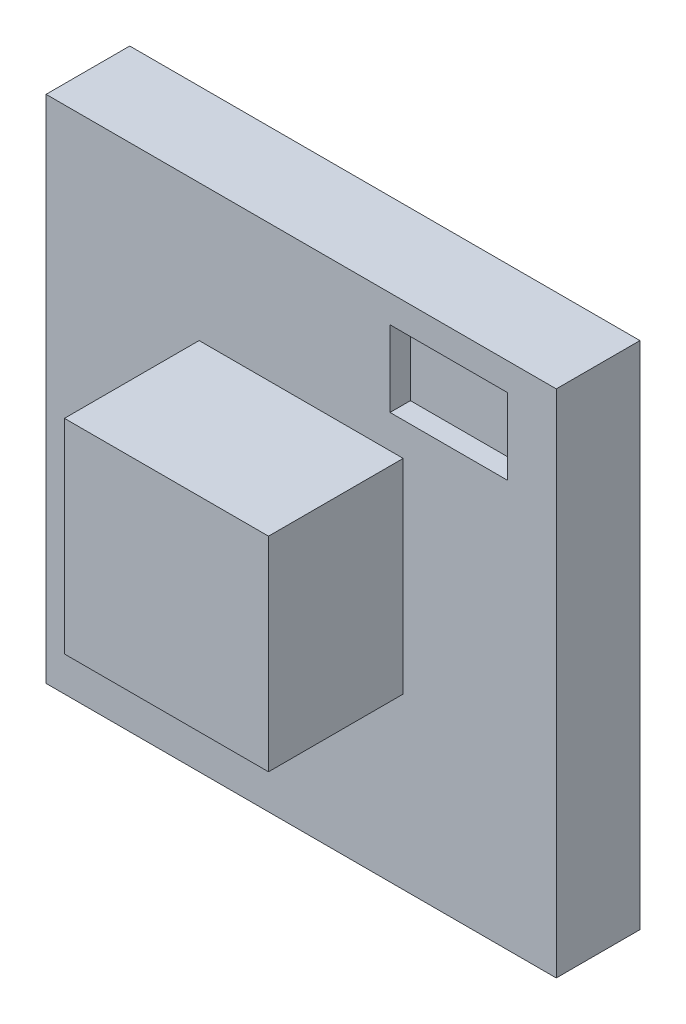
ISO-10303-21;
HEADER;
FILE_DESCRIPTION(('STEP AP214'),'2;1');
FILE_NAME('part.step','',(''),(''),'','','');
FILE_SCHEMA(('AUTOMOTIVE_DESIGN { 1 0 10303 214 1 1 1 1 }'));
ENDSEC;
DATA;
#1=APPLICATION_CONTEXT('core data for automotive mechanical design processes');
#2=APPLICATION_PROTOCOL_DEFINITION('international standard','automotive_design',2000,#1);
#3=PRODUCT_CONTEXT('',#1,'mechanical');
#4=PRODUCT('Part','Part','',(#3));
#5=PRODUCT_RELATED_PRODUCT_CATEGORY('part','',(#4));
#6=PRODUCT_DEFINITION_FORMATION('','',#4);
#7=PRODUCT_DEFINITION_CONTEXT('part definition',#1,'design');
#8=PRODUCT_DEFINITION('design','',#6,#7);
#9=PRODUCT_DEFINITION_SHAPE('','',#8);
#10=(LENGTH_UNIT() NAMED_UNIT(*) SI_UNIT(.MILLI.,.METRE.));
#11=(NAMED_UNIT(*) PLANE_ANGLE_UNIT() SI_UNIT($,.RADIAN.));
#12=(NAMED_UNIT(*) SI_UNIT($,.STERADIAN.) SOLID_ANGLE_UNIT());
#13=UNCERTAINTY_MEASURE_WITH_UNIT(LENGTH_MEASURE(1.E-05),#10,'distance_accuracy_value','');
#14=(GEOMETRIC_REPRESENTATION_CONTEXT(3) GLOBAL_UNCERTAINTY_ASSIGNED_CONTEXT((#13)) GLOBAL_UNIT_ASSIGNED_CONTEXT((#10,
#11,#12)) REPRESENTATION_CONTEXT('',''));
#15=CARTESIAN_POINT('',(0.,0.,0.));
#16=DIRECTION('',(0.,0.,1.));
#17=DIRECTION('',(1.,0.,0.));
#18=AXIS2_PLACEMENT_3D('',#15,#16,#17);
#19=CARTESIAN_POINT('',(1.17550367050315,22.1247444678527,4.1));
#20=DIRECTION('',(-1.,0.,0.));
#21=DIRECTION('',(0.,-1.,0.));
#22=AXIS2_PLACEMENT_3D('',#19,#20,#21);
#23=PLANE('',#22);
#24=DIRECTION('',(0.,1.,0.));
#25=VECTOR('',#24,1.);
#26=CARTESIAN_POINT('',(1.17550367050315,22.1247444678527,0.));
#27=LINE('',#26,#25);
#28=CARTESIAN_POINT('',(1.17550367050316,-2.87525553214727,0.));
#29=VERTEX_POINT('',#28);
#30=CARTESIAN_POINT('',(1.17550367050315,22.1247444678527,0.));
#31=VERTEX_POINT('',#30);
#32=EDGE_CURVE('E197',#29,#31,#27,.T.);
#33=ORIENTED_EDGE('',*,*,#32,.T.);
#34=DIRECTION('',(0.,0.,-1.));
#35=VECTOR('',#34,1.);
#36=CARTESIAN_POINT('',(1.17550367050315,22.1247444678527,4.1));
#37=LINE('',#36,#35);
#38=CARTESIAN_POINT('',(1.17550367050315,22.1247444678527,4.1));
#39=VERTEX_POINT('',#38);
#40=EDGE_CURVE('E11',#39,#31,#37,.T.);
#41=ORIENTED_EDGE('',*,*,#40,.F.);
#42=DIRECTION('',(0.,1.,0.));
#43=VECTOR('',#42,1.);
#44=CARTESIAN_POINT('',(1.17550367050315,22.1247444678527,4.1));
#45=LINE('',#44,#43);
#46=CARTESIAN_POINT('',(1.17550367050316,-2.87525553214727,4.1));
#47=VERTEX_POINT('',#46);
#48=EDGE_CURVE('E198',#47,#39,#45,.T.);
#49=ORIENTED_EDGE('',*,*,#48,.F.);
#50=DIRECTION('',(0.,0.,-1.));
#51=VECTOR('',#50,1.);
#52=CARTESIAN_POINT('',(1.17550367050316,-2.87525553214727,4.1));
#53=LINE('',#52,#51);
#54=EDGE_CURVE('E208',#47,#29,#53,.T.);
#55=ORIENTED_EDGE('',*,*,#54,.T.);
#56=EDGE_LOOP('',(#33,#41,#49,#55));
#57=FACE_BOUND('',#56,.T.);
#58=ADVANCED_FACE('F41',(#57),#23,.F.);
#59=CARTESIAN_POINT('',(-23.8244963294968,22.1247444678527,4.1));
#60=DIRECTION('',(0.,-1.,0.));
#61=DIRECTION('',(0.,0.,-1.));
#62=AXIS2_PLACEMENT_3D('',#59,#60,#61);
#63=PLANE('',#62);
#64=DIRECTION('',(-1.,0.,0.));
#65=VECTOR('',#64,1.);
#66=CARTESIAN_POINT('',(-23.8244963294968,22.1247444678527,0.));
#67=LINE('',#66,#65);
#68=CARTESIAN_POINT('',(-23.8244963294968,22.1247444678527,0.));
#69=VERTEX_POINT('',#68);
#70=EDGE_CURVE('E211',#31,#69,#67,.T.);
#71=ORIENTED_EDGE('',*,*,#70,.T.);
#72=DIRECTION('',(0.,0.,-1.));
#73=VECTOR('',#72,1.);
#74=CARTESIAN_POINT('',(-23.8244963294968,22.1247444678527,4.1));
#75=LINE('',#74,#73);
#76=CARTESIAN_POINT('',(-23.8244963294968,22.1247444678527,4.1));
#77=VERTEX_POINT('',#76);
#78=EDGE_CURVE('E48',#77,#69,#75,.T.);
#79=ORIENTED_EDGE('',*,*,#78,.F.);
#80=DIRECTION('',(-1.,0.,0.));
#81=VECTOR('',#80,1.);
#82=CARTESIAN_POINT('',(-23.8244963294968,22.1247444678527,4.1));
#83=LINE('',#82,#81);
#84=EDGE_CURVE('E201',#39,#77,#83,.T.);
#85=ORIENTED_EDGE('',*,*,#84,.F.);
#86=ORIENTED_EDGE('',*,*,#40,.T.);
#87=EDGE_LOOP('',(#71,#79,#85,#86));
#88=FACE_BOUND('',#87,.T.);
#89=ADVANCED_FACE('F241',(#88),#63,.F.);
#90=CARTESIAN_POINT('',(-23.8244963294968,22.1247444678527,4.1));
#91=DIRECTION('',(1.,0.,0.));
#92=DIRECTION('',(0.,1.,0.));
#93=AXIS2_PLACEMENT_3D('',#90,#91,#92);
#94=PLANE('',#93);
#95=DIRECTION('',(0.,-1.,0.));
#96=VECTOR('',#95,1.);
#97=CARTESIAN_POINT('',(-23.8244963294968,22.1247444678527,0.));
#98=LINE('',#97,#96);
#99=CARTESIAN_POINT('',(-23.8244963294968,-2.87525553214727,0.));
#100=VERTEX_POINT('',#99);
#101=EDGE_CURVE('E213',#69,#100,#98,.T.);
#102=ORIENTED_EDGE('',*,*,#101,.T.);
#103=DIRECTION('',(0.,0.,-1.));
#104=VECTOR('',#103,1.);
#105=CARTESIAN_POINT('',(-23.8244963294968,-2.87525553214727,4.1));
#106=LINE('',#105,#104);
#107=CARTESIAN_POINT('',(-23.8244963294968,-2.87525553214727,4.1));
#108=VERTEX_POINT('',#107);
#109=EDGE_CURVE('E218',#108,#100,#106,.T.);
#110=ORIENTED_EDGE('',*,*,#109,.F.);
#111=DIRECTION('',(0.,-1.,0.));
#112=VECTOR('',#111,1.);
#113=CARTESIAN_POINT('',(-23.8244963294968,22.1247444678527,4.1));
#114=LINE('',#113,#112);
#115=EDGE_CURVE('E204',#77,#108,#114,.T.);
#116=ORIENTED_EDGE('',*,*,#115,.F.);
#117=ORIENTED_EDGE('',*,*,#78,.T.);
#118=EDGE_LOOP('',(#102,#110,#116,#117));
#119=FACE_BOUND('',#118,.T.);
#120=ADVANCED_FACE('F225',(#119),#94,.F.);
#121=CARTESIAN_POINT('',(-23.8244963294968,-2.87525553214727,4.1));
#122=DIRECTION('',(0.,1.,0.));
#123=DIRECTION('',(0.,0.,1.));
#124=AXIS2_PLACEMENT_3D('',#121,#122,#123);
#125=PLANE('',#124);
#126=DIRECTION('',(1.,0.,0.));
#127=VECTOR('',#126,1.);
#128=CARTESIAN_POINT('',(-23.8244963294968,-2.87525553214727,0.));
#129=LINE('',#128,#127);
#130=EDGE_CURVE('E202',#100,#29,#129,.T.);
#131=ORIENTED_EDGE('',*,*,#130,.T.);
#132=ORIENTED_EDGE('',*,*,#54,.F.);
#133=DIRECTION('',(1.,0.,0.));
#134=VECTOR('',#133,1.);
#135=CARTESIAN_POINT('',(-23.8244963294968,-2.87525553214727,4.1));
#136=LINE('',#135,#134);
#137=EDGE_CURVE('E206',#108,#47,#136,.T.);
#138=ORIENTED_EDGE('',*,*,#137,.F.);
#139=ORIENTED_EDGE('',*,*,#109,.T.);
#140=EDGE_LOOP('',(#131,#132,#138,#139));
#141=FACE_BOUND('',#140,.T.);
#142=ADVANCED_FACE('F234',(#141),#125,.F.);
#143=CARTESIAN_POINT('',(0.,0.,4.1));
#144=DIRECTION('',(0.,0.,1.));
#145=DIRECTION('',(1.,0.,0.));
#146=AXIS2_PLACEMENT_3D('',#143,#144,#145);
#147=PLANE('',#146);
#148=DIRECTION('',(0.,1.,0.));
#149=VECTOR('',#148,1.);
#150=CARTESIAN_POINT('',(-1.21218412122066,20.7728664335739,4.1));
#151=LINE('',#150,#149);
#152=CARTESIAN_POINT('',(-1.21218412122066,17.0509737458055,4.1));
#153=VERTEX_POINT('',#152);
#154=CARTESIAN_POINT('',(-1.21218412122066,20.7728664335739,4.1));
#155=VERTEX_POINT('',#154);
#156=EDGE_CURVE('E55',#153,#155,#151,.T.);
#157=ORIENTED_EDGE('',*,*,#156,.F.);
#158=DIRECTION('',(1.,0.,0.));
#159=VECTOR('',#158,1.);
#160=CARTESIAN_POINT('',(-6.97058412871127,17.0509737458055,4.1));
#161=LINE('',#160,#159);
#162=CARTESIAN_POINT('',(-6.97058412871127,17.0509737458055,4.1));
#163=VERTEX_POINT('',#162);
#164=EDGE_CURVE('E149',#163,#153,#161,.T.);
#165=ORIENTED_EDGE('',*,*,#164,.F.);
#166=DIRECTION('',(0.,-1.,0.));
#167=VECTOR('',#166,1.);
#168=CARTESIAN_POINT('',(-6.97058412871127,20.7728664335739,4.1));
#169=LINE('',#168,#167);
#170=CARTESIAN_POINT('',(-6.97058412871127,20.7728664335739,4.1));
#171=VERTEX_POINT('',#170);
#172=EDGE_CURVE('E152',#171,#163,#169,.T.);
#173=ORIENTED_EDGE('',*,*,#172,.F.);
#174=DIRECTION('',(-1.,0.,0.));
#175=VECTOR('',#174,1.);
#176=CARTESIAN_POINT('',(-6.97058412871127,20.7728664335739,4.1));
#177=LINE('',#176,#175);
#178=EDGE_CURVE('E158',#155,#171,#177,.T.);
#179=ORIENTED_EDGE('',*,*,#178,.F.);
#180=EDGE_LOOP('',(#157,#165,#173,#179));
#181=FACE_BOUND('',#180,.T.);
#182=DIRECTION('',(0.,1.,0.));
#183=VECTOR('',#182,1.);
#184=CARTESIAN_POINT('',(-6.32449632949684,15.4247444678527,4.1));
#185=LINE('',#184,#183);
#186=CARTESIAN_POINT('',(-6.32449632949684,5.42474446785273,4.1));
#187=VERTEX_POINT('',#186);
#188=CARTESIAN_POINT('',(-6.32449632949684,15.4247444678527,4.1));
#189=VERTEX_POINT('',#188);
#190=EDGE_CURVE('E63',#187,#189,#185,.T.);
#191=ORIENTED_EDGE('',*,*,#190,.F.);
#192=DIRECTION('',(1.,0.,0.));
#193=VECTOR('',#192,1.);
#194=CARTESIAN_POINT('',(-16.3244963294968,5.42474446785273,4.1));
#195=LINE('',#194,#193);
#196=CARTESIAN_POINT('',(-16.3244963294968,5.42474446785273,4.1));
#197=VERTEX_POINT('',#196);
#198=EDGE_CURVE('E171',#197,#187,#195,.T.);
#199=ORIENTED_EDGE('',*,*,#198,.F.);
#200=DIRECTION('',(0.,-1.,0.));
#201=VECTOR('',#200,1.);
#202=CARTESIAN_POINT('',(-16.3244963294968,15.4247444678527,4.1));
#203=LINE('',#202,#201);
#204=CARTESIAN_POINT('',(-16.3244963294968,15.4247444678527,4.1));
#205=VERTEX_POINT('',#204);
#206=EDGE_CURVE('E182',#205,#197,#203,.T.);
#207=ORIENTED_EDGE('',*,*,#206,.F.);
#208=DIRECTION('',(-1.,0.,0.));
#209=VECTOR('',#208,1.);
#210=CARTESIAN_POINT('',(-16.3244963294968,15.4247444678527,4.1));
#211=LINE('',#210,#209);
#212=EDGE_CURVE('E179',#189,#205,#211,.T.);
#213=ORIENTED_EDGE('',*,*,#212,.F.);
#214=EDGE_LOOP('',(#191,#199,#207,#213));
#215=FACE_BOUND('',#214,.T.);
#216=ORIENTED_EDGE('',*,*,#48,.T.);
#217=ORIENTED_EDGE('',*,*,#84,.T.);
#218=ORIENTED_EDGE('',*,*,#115,.T.);
#219=ORIENTED_EDGE('',*,*,#137,.T.);
#220=EDGE_LOOP('',(#216,#217,#218,#219));
#221=FACE_BOUND('',#220,.T.);
#222=ADVANCED_FACE('F240',(#181,#215,#221),#147,.T.);
#223=CARTESIAN_POINT('',(0.,0.,0.));
#224=DIRECTION('',(0.,0.,1.));
#225=DIRECTION('',(1.,0.,0.));
#226=AXIS2_PLACEMENT_3D('',#223,#224,#225);
#227=PLANE('',#226);
#228=ORIENTED_EDGE('',*,*,#32,.F.);
#229=ORIENTED_EDGE('',*,*,#130,.F.);
#230=ORIENTED_EDGE('',*,*,#101,.F.);
#231=ORIENTED_EDGE('',*,*,#70,.F.);
#232=EDGE_LOOP('',(#228,#229,#230,#231));
#233=FACE_BOUND('',#232,.T.);
#234=ADVANCED_FACE('F231',(#233),#227,.F.);
#235=CARTESIAN_POINT('',(-6.32449632949684,15.4247444678527,10.7));
#236=DIRECTION('',(-1.,0.,0.));
#237=DIRECTION('',(0.,-1.,0.));
#238=AXIS2_PLACEMENT_3D('',#235,#236,#237);
#239=PLANE('',#238);
#240=ORIENTED_EDGE('',*,*,#190,.T.);
#241=DIRECTION('',(0.,0.,-1.));
#242=VECTOR('',#241,1.);
#243=CARTESIAN_POINT('',(-6.32449632949684,15.4247444678527,10.7));
#244=LINE('',#243,#242);
#245=CARTESIAN_POINT('',(-6.32449632949684,15.4247444678527,10.7));
#246=VERTEX_POINT('',#245);
#247=EDGE_CURVE('E194',#246,#189,#244,.T.);
#248=ORIENTED_EDGE('',*,*,#247,.F.);
#249=DIRECTION('',(0.,1.,0.));
#250=VECTOR('',#249,1.);
#251=CARTESIAN_POINT('',(-6.32449632949684,15.4247444678527,10.7));
#252=LINE('',#251,#250);
#253=CARTESIAN_POINT('',(-6.32449632949684,5.42474446785273,10.7));
#254=VERTEX_POINT('',#253);
#255=EDGE_CURVE('E167',#254,#246,#252,.T.);
#256=ORIENTED_EDGE('',*,*,#255,.F.);
#257=DIRECTION('',(0.,0.,-1.));
#258=VECTOR('',#257,1.);
#259=CARTESIAN_POINT('',(-6.32449632949684,5.42474446785273,10.7));
#260=LINE('',#259,#258);
#261=EDGE_CURVE('E177',#254,#187,#260,.T.);
#262=ORIENTED_EDGE('',*,*,#261,.T.);
#263=EDGE_LOOP('',(#240,#248,#256,#262));
#264=FACE_BOUND('',#263,.T.);
#265=ADVANCED_FACE('F253',(#264),#239,.F.);
#266=CARTESIAN_POINT('',(-16.3244963294968,15.4247444678527,10.7));
#267=DIRECTION('',(0.,-1.,0.));
#268=DIRECTION('',(0.,0.,-1.));
#269=AXIS2_PLACEMENT_3D('',#266,#267,#268);
#270=PLANE('',#269);
#271=ORIENTED_EDGE('',*,*,#212,.T.);
#272=DIRECTION('',(0.,0.,-1.));
#273=VECTOR('',#272,1.);
#274=CARTESIAN_POINT('',(-16.3244963294968,15.4247444678527,10.7));
#275=LINE('',#274,#273);
#276=CARTESIAN_POINT('',(-16.3244963294968,15.4247444678527,10.7));
#277=VERTEX_POINT('',#276);
#278=EDGE_CURVE('E191',#277,#205,#275,.T.);
#279=ORIENTED_EDGE('',*,*,#278,.F.);
#280=DIRECTION('',(-1.,0.,0.));
#281=VECTOR('',#280,1.);
#282=CARTESIAN_POINT('',(-16.3244963294968,15.4247444678527,10.7));
#283=LINE('',#282,#281);
#284=EDGE_CURVE('E170',#246,#277,#283,.T.);
#285=ORIENTED_EDGE('',*,*,#284,.F.);
#286=ORIENTED_EDGE('',*,*,#247,.T.);
#287=EDGE_LOOP('',(#271,#279,#285,#286));
#288=FACE_BOUND('',#287,.T.);
#289=ADVANCED_FACE('F259',(#288),#270,.F.);
#290=CARTESIAN_POINT('',(-16.3244963294968,15.4247444678527,10.7));
#291=DIRECTION('',(1.,0.,0.));
#292=DIRECTION('',(0.,1.,0.));
#293=AXIS2_PLACEMENT_3D('',#290,#291,#292);
#294=PLANE('',#293);
#295=ORIENTED_EDGE('',*,*,#206,.T.);
#296=DIRECTION('',(0.,0.,-1.));
#297=VECTOR('',#296,1.);
#298=CARTESIAN_POINT('',(-16.3244963294968,5.42474446785273,10.7));
#299=LINE('',#298,#297);
#300=CARTESIAN_POINT('',(-16.3244963294968,5.42474446785273,10.7));
#301=VERTEX_POINT('',#300);
#302=EDGE_CURVE('E188',#301,#197,#299,.T.);
#303=ORIENTED_EDGE('',*,*,#302,.F.);
#304=DIRECTION('',(0.,-1.,0.));
#305=VECTOR('',#304,1.);
#306=CARTESIAN_POINT('',(-16.3244963294968,15.4247444678527,10.7));
#307=LINE('',#306,#305);
#308=EDGE_CURVE('E173',#277,#301,#307,.T.);
#309=ORIENTED_EDGE('',*,*,#308,.F.);
#310=ORIENTED_EDGE('',*,*,#278,.T.);
#311=EDGE_LOOP('',(#295,#303,#309,#310));
#312=FACE_BOUND('',#311,.T.);
#313=ADVANCED_FACE('F263',(#312),#294,.F.);
#314=CARTESIAN_POINT('',(-16.3244963294968,5.42474446785273,10.7));
#315=DIRECTION('',(0.,1.,0.));
#316=DIRECTION('',(0.,0.,1.));
#317=AXIS2_PLACEMENT_3D('',#314,#315,#316);
#318=PLANE('',#317);
#319=ORIENTED_EDGE('',*,*,#198,.T.);
#320=ORIENTED_EDGE('',*,*,#261,.F.);
#321=DIRECTION('',(1.,0.,0.));
#322=VECTOR('',#321,1.);
#323=CARTESIAN_POINT('',(-16.3244963294968,5.42474446785273,10.7));
#324=LINE('',#323,#322);
#325=EDGE_CURVE('E175',#301,#254,#324,.T.);
#326=ORIENTED_EDGE('',*,*,#325,.F.);
#327=ORIENTED_EDGE('',*,*,#302,.T.);
#328=EDGE_LOOP('',(#319,#320,#326,#327));
#329=FACE_BOUND('',#328,.T.);
#330=ADVANCED_FACE('F267',(#329),#318,.F.);
#331=CARTESIAN_POINT('',(0.,0.,10.7));
#332=DIRECTION('',(0.,0.,1.));
#333=DIRECTION('',(1.,0.,0.));
#334=AXIS2_PLACEMENT_3D('',#331,#332,#333);
#335=PLANE('',#334);
#336=ORIENTED_EDGE('',*,*,#255,.T.);
#337=ORIENTED_EDGE('',*,*,#284,.T.);
#338=ORIENTED_EDGE('',*,*,#308,.T.);
#339=ORIENTED_EDGE('',*,*,#325,.T.);
#340=EDGE_LOOP('',(#336,#337,#338,#339));
#341=FACE_BOUND('',#340,.T.);
#342=ADVANCED_FACE('F271',(#341),#335,.T.);
#343=CARTESIAN_POINT('',(-1.21218412122066,20.7728664335739,3.1));
#344=DIRECTION('',(1.,0.,0.));
#345=DIRECTION('',(0.,0.,-1.));
#346=AXIS2_PLACEMENT_3D('',#343,#344,#345);
#347=PLANE('',#346);
#348=ORIENTED_EDGE('',*,*,#156,.T.);
#349=DIRECTION('',(0.,0.,1.));
#350=VECTOR('',#349,1.);
#351=CARTESIAN_POINT('',(-1.21218412122066,20.7728664335739,3.1));
#352=LINE('',#351,#350);
#353=CARTESIAN_POINT('',(-1.21218412122066,20.7728664335739,3.1));
#354=VERTEX_POINT('',#353);
#355=EDGE_CURVE('E127',#354,#155,#352,.T.);
#356=ORIENTED_EDGE('',*,*,#355,.F.);
#357=DIRECTION('',(0.,1.,0.));
#358=VECTOR('',#357,1.);
#359=CARTESIAN_POINT('',(-1.21218412122066,20.7728664335739,3.1));
#360=LINE('',#359,#358);
#361=CARTESIAN_POINT('',(-1.21218412122066,17.0509737458055,3.1));
#362=VERTEX_POINT('',#361);
#363=EDGE_CURVE('E131',#362,#354,#360,.T.);
#364=ORIENTED_EDGE('',*,*,#363,.F.);
#365=DIRECTION('',(0.,0.,1.));
#366=VECTOR('',#365,1.);
#367=CARTESIAN_POINT('',(-1.21218412122066,17.0509737458055,3.1));
#368=LINE('',#367,#366);
#369=EDGE_CURVE('E162',#362,#153,#368,.T.);
#370=ORIENTED_EDGE('',*,*,#369,.T.);
#371=EDGE_LOOP('',(#348,#356,#364,#370));
#372=FACE_BOUND('',#371,.T.);
#373=ADVANCED_FACE('F129',(#372),#347,.F.);
#374=CARTESIAN_POINT('',(-6.97058412871127,17.0509737458055,3.1));
#375=DIRECTION('',(0.,-1.,0.));
#376=DIRECTION('',(0.,0.,-1.));
#377=AXIS2_PLACEMENT_3D('',#374,#375,#376);
#378=PLANE('',#377);
#379=ORIENTED_EDGE('',*,*,#164,.T.);
#380=ORIENTED_EDGE('',*,*,#369,.F.);
#381=DIRECTION('',(1.,0.,0.));
#382=VECTOR('',#381,1.);
#383=CARTESIAN_POINT('',(-6.97058412871127,17.0509737458055,3.1));
#384=LINE('',#383,#382);
#385=CARTESIAN_POINT('',(-6.97058412871127,17.0509737458055,3.1));
#386=VERTEX_POINT('',#385);
#387=EDGE_CURVE('E137',#386,#362,#384,.T.);
#388=ORIENTED_EDGE('',*,*,#387,.F.);
#389=DIRECTION('',(0.,0.,1.));
#390=VECTOR('',#389,1.);
#391=CARTESIAN_POINT('',(-6.97058412871127,17.0509737458055,3.1));
#392=LINE('',#391,#390);
#393=EDGE_CURVE('E164',#386,#163,#392,.T.);
#394=ORIENTED_EDGE('',*,*,#393,.T.);
#395=EDGE_LOOP('',(#379,#380,#388,#394));
#396=FACE_BOUND('',#395,.T.);
#397=ADVANCED_FACE('F278',(#396),#378,.F.);
#398=CARTESIAN_POINT('',(-6.97058412871127,20.7728664335739,3.1));
#399=DIRECTION('',(-1.,0.,0.));
#400=DIRECTION('',(0.,0.,1.));
#401=AXIS2_PLACEMENT_3D('',#398,#399,#400);
#402=PLANE('',#401);
#403=ORIENTED_EDGE('',*,*,#172,.T.);
#404=ORIENTED_EDGE('',*,*,#393,.F.);
#405=DIRECTION('',(0.,-1.,0.));
#406=VECTOR('',#405,1.);
#407=CARTESIAN_POINT('',(-6.97058412871127,20.7728664335739,3.1));
#408=LINE('',#407,#406);
#409=CARTESIAN_POINT('',(-6.97058412871127,20.7728664335739,3.1));
#410=VERTEX_POINT('',#409);
#411=EDGE_CURVE('E145',#410,#386,#408,.T.);
#412=ORIENTED_EDGE('',*,*,#411,.F.);
#413=DIRECTION('',(0.,0.,1.));
#414=VECTOR('',#413,1.);
#415=CARTESIAN_POINT('',(-6.97058412871127,20.7728664335739,3.1));
#416=LINE('',#415,#414);
#417=EDGE_CURVE('E136',#410,#171,#416,.T.);
#418=ORIENTED_EDGE('',*,*,#417,.T.);
#419=EDGE_LOOP('',(#403,#404,#412,#418));
#420=FACE_BOUND('',#419,.T.);
#421=ADVANCED_FACE('F281',(#420),#402,.F.);
#422=CARTESIAN_POINT('',(-6.97058412871127,20.7728664335739,3.1));
#423=DIRECTION('',(0.,1.,0.));
#424=DIRECTION('',(0.,0.,1.));
#425=AXIS2_PLACEMENT_3D('',#422,#423,#424);
#426=PLANE('',#425);
#427=ORIENTED_EDGE('',*,*,#178,.T.);
#428=ORIENTED_EDGE('',*,*,#417,.F.);
#429=DIRECTION('',(-1.,0.,0.));
#430=VECTOR('',#429,1.);
#431=CARTESIAN_POINT('',(-6.97058412871127,20.7728664335739,3.1));
#432=LINE('',#431,#430);
#433=EDGE_CURVE('E140',#354,#410,#432,.T.);
#434=ORIENTED_EDGE('',*,*,#433,.F.);
#435=ORIENTED_EDGE('',*,*,#355,.T.);
#436=EDGE_LOOP('',(#427,#428,#434,#435));
#437=FACE_BOUND('',#436,.T.);
#438=ADVANCED_FACE('F141',(#437),#426,.F.);
#439=CARTESIAN_POINT('',(0.,0.,3.1));
#440=DIRECTION('',(0.,0.,1.));
#441=DIRECTION('',(1.,0.,0.));
#442=AXIS2_PLACEMENT_3D('',#439,#440,#441);
#443=PLANE('',#442);
#444=ORIENTED_EDGE('',*,*,#363,.T.);
#445=ORIENTED_EDGE('',*,*,#433,.T.);
#446=ORIENTED_EDGE('',*,*,#411,.T.);
#447=ORIENTED_EDGE('',*,*,#387,.T.);
#448=EDGE_LOOP('',(#444,#445,#446,#447));
#449=FACE_BOUND('',#448,.T.);
#450=ADVANCED_FACE('F147',(#449),#443,.T.);
#451=CLOSED_SHELL('',(#58,#89,#120,#142,#222,#234,#265,#289,#313,#330,#342,#373,#397,#421,#438,#450));
#452=MANIFOLD_SOLID_BREP('B2',#451);
#453=ADVANCED_BREP_SHAPE_REPRESENTATION('',(#18,#452),#14);
#454=SHAPE_DEFINITION_REPRESENTATION(#9,#453);
ENDSEC;
END-ISO-10303-21;
